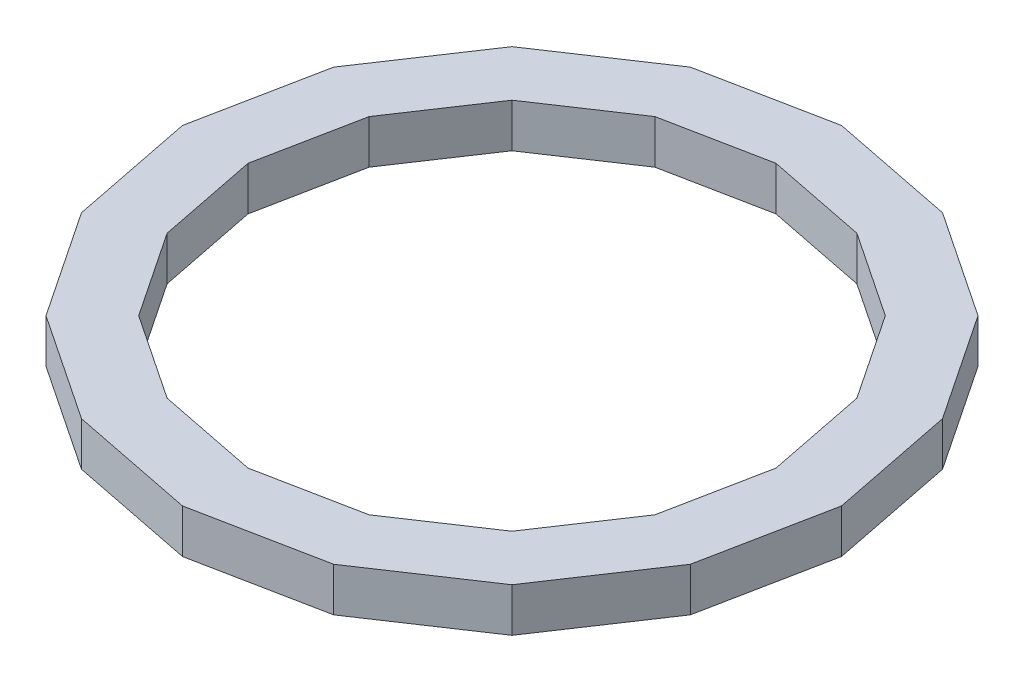
ISO-10303-21;
HEADER;
FILE_DESCRIPTION(('STEP AP214'),'2;1');
FILE_NAME('part.step','',(''),(''),'','','');
FILE_SCHEMA(('AUTOMOTIVE_DESIGN { 1 0 10303 214 1 1 1 1 }'));
ENDSEC;
DATA;
#1=APPLICATION_CONTEXT('core data for automotive mechanical design processes');
#2=APPLICATION_PROTOCOL_DEFINITION('international standard','automotive_design',2000,#1);
#3=PRODUCT_CONTEXT('',#1,'mechanical');
#4=PRODUCT('Part','Part','',(#3));
#5=PRODUCT_RELATED_PRODUCT_CATEGORY('part','',(#4));
#6=PRODUCT_DEFINITION_FORMATION('','',#4);
#7=PRODUCT_DEFINITION_CONTEXT('part definition',#1,'design');
#8=PRODUCT_DEFINITION('design','',#6,#7);
#9=PRODUCT_DEFINITION_SHAPE('','',#8);
#10=(LENGTH_UNIT() NAMED_UNIT(*) SI_UNIT(.MILLI.,.METRE.));
#11=(NAMED_UNIT(*) PLANE_ANGLE_UNIT() SI_UNIT($,.RADIAN.));
#12=(NAMED_UNIT(*) SI_UNIT($,.STERADIAN.) SOLID_ANGLE_UNIT());
#13=UNCERTAINTY_MEASURE_WITH_UNIT(LENGTH_MEASURE(1.E-05),#10,'distance_accuracy_value','');
#14=(GEOMETRIC_REPRESENTATION_CONTEXT(3) GLOBAL_UNCERTAINTY_ASSIGNED_CONTEXT((#13)) GLOBAL_UNIT_ASSIGNED_CONTEXT((#10,
#11,#12)) REPRESENTATION_CONTEXT('',''));
#15=CARTESIAN_POINT('',(0.,0.,0.));
#16=DIRECTION('',(0.,0.,1.));
#17=DIRECTION('',(1.,0.,0.));
#18=AXIS2_PLACEMENT_3D('',#15,#16,#17);
#19=CARTESIAN_POINT('',(0.,19.05,0.));
#20=DIRECTION('',(0.,1.,0.));
#21=DIRECTION('',(0.,0.,1.));
#22=AXIS2_PLACEMENT_3D('',#19,#20,#21);
#23=PLANE('',#22);
#24=DIRECTION('',(0.195090322016117,0.,-0.980785280403233));
#25=VECTOR('',#24,1.);
#26=CARTESIAN_POINT('',(132.314068025535,19.05,54.8062814689309));
#27=LINE('',#26,#25);
#28=CARTESIAN_POINT('',(132.314068025535,19.05,54.8062814689309));
#29=VERTEX_POINT('',#28);
#30=CARTESIAN_POINT('',(143.215715219795,19.05,-1.60635137054443E-12));
#31=VERTEX_POINT('',#30);
#32=EDGE_CURVE('E376',#29,#31,#27,.T.);
#33=ORIENTED_EDGE('',*,*,#32,.T.);
#34=DIRECTION('',(-0.195090322016139,0.,-0.980785280403228));
#35=VECTOR('',#34,1.);
#36=CARTESIAN_POINT('',(143.215715219795,19.05,-1.60635137054443E-12));
#37=LINE('',#36,#35);
#38=CARTESIAN_POINT('',(132.314068025533,19.05,-54.806281468934));
#39=VERTEX_POINT('',#38);
#40=EDGE_CURVE('E379',#31,#39,#37,.T.);
#41=ORIENTED_EDGE('',*,*,#40,.T.);
#42=DIRECTION('',(-0.555570233019612,0.,-0.831469612302539));
#43=VECTOR('',#42,1.);
#44=CARTESIAN_POINT('',(132.314068025533,19.05,-54.806281468934));
#45=LINE('',#44,#43);
#46=CARTESIAN_POINT('',(101.268803404397,19.05,-101.2688034044));
#47=VERTEX_POINT('',#46);
#48=EDGE_CURVE('E382',#39,#47,#45,.T.);
#49=ORIENTED_EDGE('',*,*,#48,.T.);
#50=DIRECTION('',(-0.831469612302551,0.,-0.555570233019593));
#51=VECTOR('',#50,1.);
#52=CARTESIAN_POINT('',(101.268803404397,19.05,-101.2688034044));
#53=LINE('',#52,#51);
#54=CARTESIAN_POINT('',(54.8062814689308,19.05,-132.314068025535));
#55=VERTEX_POINT('',#54);
#56=EDGE_CURVE('E384',#47,#55,#53,.T.);
#57=ORIENTED_EDGE('',*,*,#56,.T.);
#58=DIRECTION('',(-0.980785280403233,0.,-0.195090322016117));
#59=VECTOR('',#58,1.);
#60=CARTESIAN_POINT('',(54.8062814689308,19.05,-132.314068025535));
#61=LINE('',#60,#59);
#62=CARTESIAN_POINT('',(-1.70496894739643E-12,19.05,-143.215715219795));
#63=VERTEX_POINT('',#62);
#64=EDGE_CURVE('E386',#55,#63,#61,.T.);
#65=ORIENTED_EDGE('',*,*,#64,.T.);
#66=DIRECTION('',(-0.980785280403228,0.,0.195090322016139));
#67=VECTOR('',#66,1.);
#68=CARTESIAN_POINT('',(-1.70496894739643E-12,19.05,-143.215715219795));
#69=LINE('',#68,#67);
#70=CARTESIAN_POINT('',(-54.806281468934,19.05,-132.314068025533));
#71=VERTEX_POINT('',#70);
#72=EDGE_CURVE('E388',#63,#71,#69,.T.);
#73=ORIENTED_EDGE('',*,*,#72,.T.);
#74=DIRECTION('',(-0.831469612302539,0.,0.555570233019612));
#75=VECTOR('',#74,1.);
#76=CARTESIAN_POINT('',(-54.806281468934,19.05,-132.314068025533));
#77=LINE('',#76,#75);
#78=CARTESIAN_POINT('',(-101.2688034044,19.05,-101.268803404397));
#79=VERTEX_POINT('',#78);
#80=EDGE_CURVE('E390',#71,#79,#77,.T.);
#81=ORIENTED_EDGE('',*,*,#80,.T.);
#82=DIRECTION('',(-0.555570233019593,0.,0.831469612302552));
#83=VECTOR('',#82,1.);
#84=CARTESIAN_POINT('',(-101.2688034044,19.05,-101.268803404397));
#85=LINE('',#84,#83);
#86=CARTESIAN_POINT('',(-132.314068025535,19.05,-54.8062814689309));
#87=VERTEX_POINT('',#86);
#88=EDGE_CURVE('E392',#79,#87,#85,.T.);
#89=ORIENTED_EDGE('',*,*,#88,.T.);
#90=DIRECTION('',(-0.195090322016117,0.,0.980785280403233));
#91=VECTOR('',#90,1.);
#92=CARTESIAN_POINT('',(-132.314068025535,19.05,-54.8062814689309));
#93=LINE('',#92,#91);
#94=CARTESIAN_POINT('',(-143.215715219795,19.05,1.60751201898995E-12));
#95=VERTEX_POINT('',#94);
#96=EDGE_CURVE('E395',#87,#95,#93,.T.);
#97=ORIENTED_EDGE('',*,*,#96,.T.);
#98=DIRECTION('',(0.195090322016139,0.,0.980785280403228));
#99=VECTOR('',#98,1.);
#100=CARTESIAN_POINT('',(-143.215715219795,19.05,1.60751201898995E-12));
#101=LINE('',#100,#99);
#102=CARTESIAN_POINT('',(-132.314068025533,19.05,54.806281468934));
#103=VERTEX_POINT('',#102);
#104=EDGE_CURVE('E397',#95,#103,#101,.T.);
#105=ORIENTED_EDGE('',*,*,#104,.T.);
#106=DIRECTION('',(0.555570233019612,0.,0.831469612302539));
#107=VECTOR('',#106,1.);
#108=CARTESIAN_POINT('',(-132.314068025533,19.05,54.806281468934));
#109=LINE('',#108,#107);
#110=CARTESIAN_POINT('',(-101.268803404397,19.05,101.2688034044));
#111=VERTEX_POINT('',#110);
#112=EDGE_CURVE('E399',#103,#111,#109,.T.);
#113=ORIENTED_EDGE('',*,*,#112,.T.);
#114=DIRECTION('',(0.831469612302552,0.,0.555570233019593));
#115=VECTOR('',#114,1.);
#116=CARTESIAN_POINT('',(-101.268803404397,19.05,101.2688034044));
#117=LINE('',#116,#115);
#118=CARTESIAN_POINT('',(-54.806281468931,19.05,132.314068025535));
#119=VERTEX_POINT('',#118);
#120=EDGE_CURVE('E402',#111,#119,#117,.T.);
#121=ORIENTED_EDGE('',*,*,#120,.T.);
#122=DIRECTION('',(0.980785280403233,0.,0.195090322016118));
#123=VECTOR('',#122,1.);
#124=CARTESIAN_POINT('',(-54.806281468931,19.05,132.314068025535));
#125=LINE('',#124,#123);
#126=CARTESIAN_POINT('',(1.54858701511086E-12,19.05,143.215715219795));
#127=VERTEX_POINT('',#126);
#128=EDGE_CURVE('E405',#119,#127,#125,.T.);
#129=ORIENTED_EDGE('',*,*,#128,.T.);
#130=DIRECTION('',(0.980785280403228,0.,-0.19509032201614));
#131=VECTOR('',#130,1.);
#132=CARTESIAN_POINT('',(1.54858701511086E-12,19.05,143.215715219795));
#133=LINE('',#132,#131);
#134=CARTESIAN_POINT('',(54.8062814689339,19.05,132.314068025533));
#135=VERTEX_POINT('',#134);
#136=EDGE_CURVE('E407',#127,#135,#133,.T.);
#137=ORIENTED_EDGE('',*,*,#136,.T.);
#138=DIRECTION('',(0.831469612302539,0.,-0.555570233019611));
#139=VECTOR('',#138,1.);
#140=CARTESIAN_POINT('',(54.8062814689339,19.05,132.314068025533));
#141=LINE('',#140,#139);
#142=CARTESIAN_POINT('',(101.2688034044,19.05,101.268803404397));
#143=VERTEX_POINT('',#142);
#144=EDGE_CURVE('E410',#135,#143,#141,.T.);
#145=ORIENTED_EDGE('',*,*,#144,.T.);
#146=DIRECTION('',(0.555570233019593,0.,-0.831469612302552));
#147=VECTOR('',#146,1.);
#148=CARTESIAN_POINT('',(101.2688034044,19.05,101.268803404397));
#149=LINE('',#148,#147);
#150=EDGE_CURVE('E413',#143,#29,#149,.T.);
#151=ORIENTED_EDGE('',*,*,#150,.T.);
#152=EDGE_LOOP('',(#33,#41,#49,#57,#65,#73,#81,#89,#97,#105,#113,#121,#129,#137,#145,#151));
#153=FACE_BOUND('',#152,.T.);
#154=DIRECTION('',(-0.195090322016139,0.,-0.980785280403228));
#155=VECTOR('',#154,1.);
#156=CARTESIAN_POINT('',(114.728338259455,19.05,-1.33749485110041E-12));
#157=LINE('',#156,#155);
#158=CARTESIAN_POINT('',(114.728338259455,19.05,-1.33749485110041E-12));
#159=VERTEX_POINT('',#158);
#160=CARTESIAN_POINT('',(105.995163516941,19.05,-43.9046342746724));
#161=VERTEX_POINT('',#160);
#162=EDGE_CURVE('E252',#159,#161,#157,.T.);
#163=ORIENTED_EDGE('',*,*,#162,.F.);
#164=DIRECTION('',(0.195090322016117,0.,-0.980785280403233));
#165=VECTOR('',#164,1.);
#166=CARTESIAN_POINT('',(105.995163516942,19.05,43.9046342746699));
#167=LINE('',#166,#165);
#168=CARTESIAN_POINT('',(105.995163516942,19.05,43.9046342746699));
#169=VERTEX_POINT('',#168);
#170=EDGE_CURVE('E243',#169,#159,#167,.T.);
#171=ORIENTED_EDGE('',*,*,#170,.F.);
#172=DIRECTION('',(0.555570233019593,0.,-0.831469612302552));
#173=VECTOR('',#172,1.);
#174=CARTESIAN_POINT('',(81.1251859775254,19.05,81.1251859775235));
#175=LINE('',#174,#173);
#176=CARTESIAN_POINT('',(81.1251859775254,19.05,81.1251859775235));
#177=VERTEX_POINT('',#176);
#178=EDGE_CURVE('E296',#177,#169,#175,.T.);
#179=ORIENTED_EDGE('',*,*,#178,.F.);
#180=DIRECTION('',(0.831469612302539,0.,-0.555570233019612));
#181=VECTOR('',#180,1.);
#182=CARTESIAN_POINT('',(43.9046342746724,19.05,105.995163516941));
#183=LINE('',#182,#181);
#184=CARTESIAN_POINT('',(43.9046342746724,19.05,105.995163516941));
#185=VERTEX_POINT('',#184);
#186=EDGE_CURVE('E294',#185,#177,#183,.T.);
#187=ORIENTED_EDGE('',*,*,#186,.F.);
#188=DIRECTION('',(0.980785280403228,0.,-0.19509032201614));
#189=VECTOR('',#188,1.);
#190=CARTESIAN_POINT('',(1.3258200176862E-12,19.05,114.728338259455));
#191=LINE('',#190,#189);
#192=CARTESIAN_POINT('',(1.3258200176862E-12,19.05,114.728338259455));
#193=VERTEX_POINT('',#192);
#194=EDGE_CURVE('E292',#193,#185,#191,.T.);
#195=ORIENTED_EDGE('',*,*,#194,.F.);
#196=DIRECTION('',(0.980785280403233,0.,0.195090322016117));
#197=VECTOR('',#196,1.);
#198=CARTESIAN_POINT('',(-43.9046342746699,19.05,105.995163516942));
#199=LINE('',#198,#197);
#200=CARTESIAN_POINT('',(-43.9046342746699,19.05,105.995163516942));
#201=VERTEX_POINT('',#200);
#202=EDGE_CURVE('E290',#201,#193,#199,.T.);
#203=ORIENTED_EDGE('',*,*,#202,.F.);
#204=DIRECTION('',(0.831469612302552,0.,0.555570233019593));
#205=VECTOR('',#204,1.);
#206=CARTESIAN_POINT('',(-81.1251859775235,19.05,81.1251859775254));
#207=LINE('',#206,#205);
#208=CARTESIAN_POINT('',(-81.1251859775235,19.05,81.1251859775254));
#209=VERTEX_POINT('',#208);
#210=EDGE_CURVE('E288',#209,#201,#207,.T.);
#211=ORIENTED_EDGE('',*,*,#210,.F.);
#212=DIRECTION('',(0.555570233019612,0.,0.831469612302539));
#213=VECTOR('',#212,1.);
#214=CARTESIAN_POINT('',(-105.995163516941,19.05,43.9046342746724));
#215=LINE('',#214,#213);
#216=CARTESIAN_POINT('',(-105.995163516941,19.05,43.9046342746724));
#217=VERTEX_POINT('',#216);
#218=EDGE_CURVE('E285',#217,#209,#215,.T.);
#219=ORIENTED_EDGE('',*,*,#218,.F.);
#220=DIRECTION('',(0.195090322016139,0.,0.980785280403228));
#221=VECTOR('',#220,1.);
#222=CARTESIAN_POINT('',(-114.728338259455,19.05,1.36437975131882E-12));
#223=LINE('',#222,#221);
#224=CARTESIAN_POINT('',(-114.728338259455,19.05,1.36437975131882E-12));
#225=VERTEX_POINT('',#224);
#226=EDGE_CURVE('E283',#225,#217,#223,.T.);
#227=ORIENTED_EDGE('',*,*,#226,.F.);
#228=DIRECTION('',(-0.195090322016117,0.,0.980785280403233));
#229=VECTOR('',#228,1.);
#230=CARTESIAN_POINT('',(-105.995163516942,19.05,-43.9046342746699));
#231=LINE('',#230,#229);
#232=CARTESIAN_POINT('',(-105.995163516942,19.05,-43.9046342746699));
#233=VERTEX_POINT('',#232);
#234=EDGE_CURVE('E280',#233,#225,#231,.T.);
#235=ORIENTED_EDGE('',*,*,#234,.F.);
#236=DIRECTION('',(-0.555570233019593,0.,0.831469612302552));
#237=VECTOR('',#236,1.);
#238=CARTESIAN_POINT('',(-81.1251859775253,19.05,-81.1251859775235));
#239=LINE('',#238,#237);
#240=CARTESIAN_POINT('',(-81.1251859775253,19.05,-81.1251859775235));
#241=VERTEX_POINT('',#240);
#242=EDGE_CURVE('E277',#241,#233,#239,.T.);
#243=ORIENTED_EDGE('',*,*,#242,.F.);
#244=DIRECTION('',(-0.831469612302539,0.,0.555570233019612));
#245=VECTOR('',#244,1.);
#246=CARTESIAN_POINT('',(-43.9046342746724,19.05,-105.995163516941));
#247=LINE('',#246,#245);
#248=CARTESIAN_POINT('',(-43.9046342746724,19.05,-105.995163516941));
#249=VERTEX_POINT('',#248);
#250=EDGE_CURVE('E275',#249,#241,#247,.T.);
#251=ORIENTED_EDGE('',*,*,#250,.F.);
#252=DIRECTION('',(-0.980785280403228,0.,0.19509032201614));
#253=VECTOR('',#252,1.);
#254=CARTESIAN_POINT('',(-1.35447008747833E-12,19.05,-114.728338259455));
#255=LINE('',#254,#253);
#256=CARTESIAN_POINT('',(-1.35447008747833E-12,19.05,-114.728338259455));
#257=VERTEX_POINT('',#256);
#258=EDGE_CURVE('E273',#257,#249,#255,.T.);
#259=ORIENTED_EDGE('',*,*,#258,.F.);
#260=DIRECTION('',(-0.980785280403233,0.,-0.195090322016117));
#261=VECTOR('',#260,1.);
#262=CARTESIAN_POINT('',(43.90463427467,19.05,-105.995163516942));
#263=LINE('',#262,#261);
#264=CARTESIAN_POINT('',(43.90463427467,19.05,-105.995163516942));
#265=VERTEX_POINT('',#264);
#266=EDGE_CURVE('E271',#265,#257,#263,.T.);
#267=ORIENTED_EDGE('',*,*,#266,.F.);
#268=DIRECTION('',(-0.831469612302552,0.,-0.555570233019592));
#269=VECTOR('',#268,1.);
#270=CARTESIAN_POINT('',(81.1251859775235,19.05,-81.1251859775254));
#271=LINE('',#270,#269);
#272=CARTESIAN_POINT('',(81.1251859775235,19.05,-81.1251859775254));
#273=VERTEX_POINT('',#272);
#274=EDGE_CURVE('E267',#273,#265,#271,.T.);
#275=ORIENTED_EDGE('',*,*,#274,.F.);
#276=DIRECTION('',(-0.555570233019612,0.,-0.831469612302539));
#277=VECTOR('',#276,1.);
#278=CARTESIAN_POINT('',(105.995163516941,19.05,-43.9046342746724));
#279=LINE('',#278,#277);
#280=EDGE_CURVE('E265',#161,#273,#279,.T.);
#281=ORIENTED_EDGE('',*,*,#280,.F.);
#282=EDGE_LOOP('',(#163,#171,#179,#187,#195,#203,#211,#219,#227,#235,#243,#251,#259,#267,#275,#281));
#283=FACE_BOUND('',#282,.T.);
#284=ADVANCED_FACE('F34',(#153,#283),#23,.T.);
#285=CARTESIAN_POINT('',(0.,0.,0.));
#286=DIRECTION('',(0.,1.,0.));
#287=DIRECTION('',(0.,0.,1.));
#288=AXIS2_PLACEMENT_3D('',#285,#286,#287);
#289=PLANE('',#288);
#290=DIRECTION('',(0.195090322016117,0.,-0.980785280403233));
#291=VECTOR('',#290,1.);
#292=CARTESIAN_POINT('',(132.314068025535,0.,54.8062814689309));
#293=LINE('',#292,#291);
#294=CARTESIAN_POINT('',(132.314068025535,0.,54.8062814689309));
#295=VERTEX_POINT('',#294);
#296=CARTESIAN_POINT('',(143.215715219795,0.,-1.60635137054443E-12));
#297=VERTEX_POINT('',#296);
#298=EDGE_CURVE('E260',#295,#297,#293,.T.);
#299=ORIENTED_EDGE('',*,*,#298,.F.);
#300=DIRECTION('',(0.555570233019593,0.,-0.831469612302552));
#301=VECTOR('',#300,1.);
#302=CARTESIAN_POINT('',(101.2688034044,0.,101.268803404397));
#303=LINE('',#302,#301);
#304=CARTESIAN_POINT('',(101.2688034044,0.,101.268803404397));
#305=VERTEX_POINT('',#304);
#306=EDGE_CURVE('E380',#305,#295,#303,.T.);
#307=ORIENTED_EDGE('',*,*,#306,.F.);
#308=DIRECTION('',(0.831469612302539,0.,-0.555570233019611));
#309=VECTOR('',#308,1.);
#310=CARTESIAN_POINT('',(54.8062814689339,0.,132.314068025533));
#311=LINE('',#310,#309);
#312=CARTESIAN_POINT('',(54.8062814689339,0.,132.314068025533));
#313=VERTEX_POINT('',#312);
#314=EDGE_CURVE('E448',#313,#305,#311,.T.);
#315=ORIENTED_EDGE('',*,*,#314,.F.);
#316=DIRECTION('',(0.980785280403228,0.,-0.19509032201614));
#317=VECTOR('',#316,1.);
#318=CARTESIAN_POINT('',(1.54858701511086E-12,0.,143.215715219795));
#319=LINE('',#318,#317);
#320=CARTESIAN_POINT('',(1.54858701511086E-12,0.,143.215715219795));
#321=VERTEX_POINT('',#320);
#322=EDGE_CURVE('E445',#321,#313,#319,.T.);
#323=ORIENTED_EDGE('',*,*,#322,.F.);
#324=DIRECTION('',(0.980785280403233,0.,0.195090322016118));
#325=VECTOR('',#324,1.);
#326=CARTESIAN_POINT('',(-54.806281468931,0.,132.314068025535));
#327=LINE('',#326,#325);
#328=CARTESIAN_POINT('',(-54.806281468931,0.,132.314068025535));
#329=VERTEX_POINT('',#328);
#330=EDGE_CURVE('E442',#329,#321,#327,.T.);
#331=ORIENTED_EDGE('',*,*,#330,.F.);
#332=DIRECTION('',(0.831469612302552,0.,0.555570233019593));
#333=VECTOR('',#332,1.);
#334=CARTESIAN_POINT('',(-101.268803404397,0.,101.2688034044));
#335=LINE('',#334,#333);
#336=CARTESIAN_POINT('',(-101.268803404397,0.,101.2688034044));
#337=VERTEX_POINT('',#336);
#338=EDGE_CURVE('E439',#337,#329,#335,.T.);
#339=ORIENTED_EDGE('',*,*,#338,.F.);
#340=DIRECTION('',(0.555570233019612,0.,0.831469612302539));
#341=VECTOR('',#340,1.);
#342=CARTESIAN_POINT('',(-132.314068025533,0.,54.806281468934));
#343=LINE('',#342,#341);
#344=CARTESIAN_POINT('',(-132.314068025533,0.,54.806281468934));
#345=VERTEX_POINT('',#344);
#346=EDGE_CURVE('E437',#345,#337,#343,.T.);
#347=ORIENTED_EDGE('',*,*,#346,.F.);
#348=DIRECTION('',(0.195090322016139,0.,0.980785280403228));
#349=VECTOR('',#348,1.);
#350=CARTESIAN_POINT('',(-143.215715219795,0.,1.60751201898995E-12));
#351=LINE('',#350,#349);
#352=CARTESIAN_POINT('',(-143.215715219795,0.,1.60751201898995E-12));
#353=VERTEX_POINT('',#352);
#354=EDGE_CURVE('E434',#353,#345,#351,.T.);
#355=ORIENTED_EDGE('',*,*,#354,.F.);
#356=DIRECTION('',(-0.195090322016117,0.,0.980785280403233));
#357=VECTOR('',#356,1.);
#358=CARTESIAN_POINT('',(-132.314068025535,0.,-54.8062814689309));
#359=LINE('',#358,#357);
#360=CARTESIAN_POINT('',(-132.314068025535,0.,-54.8062814689309));
#361=VERTEX_POINT('',#360);
#362=EDGE_CURVE('E432',#361,#353,#359,.T.);
#363=ORIENTED_EDGE('',*,*,#362,.F.);
#364=DIRECTION('',(-0.555570233019593,0.,0.831469612302552));
#365=VECTOR('',#364,1.);
#366=CARTESIAN_POINT('',(-101.2688034044,0.,-101.268803404397));
#367=LINE('',#366,#365);
#368=CARTESIAN_POINT('',(-101.2688034044,0.,-101.268803404397));
#369=VERTEX_POINT('',#368);
#370=EDGE_CURVE('E430',#369,#361,#367,.T.);
#371=ORIENTED_EDGE('',*,*,#370,.F.);
#372=DIRECTION('',(-0.831469612302539,0.,0.555570233019612));
#373=VECTOR('',#372,1.);
#374=CARTESIAN_POINT('',(-54.806281468934,0.,-132.314068025533));
#375=LINE('',#374,#373);
#376=CARTESIAN_POINT('',(-54.806281468934,0.,-132.314068025533));
#377=VERTEX_POINT('',#376);
#378=EDGE_CURVE('E428',#377,#369,#375,.T.);
#379=ORIENTED_EDGE('',*,*,#378,.F.);
#380=DIRECTION('',(-0.980785280403228,0.,0.195090322016139));
#381=VECTOR('',#380,1.);
#382=CARTESIAN_POINT('',(-1.70496894739643E-12,0.,-143.215715219795));
#383=LINE('',#382,#381);
#384=CARTESIAN_POINT('',(-1.70496894739643E-12,0.,-143.215715219795));
#385=VERTEX_POINT('',#384);
#386=EDGE_CURVE('E426',#385,#377,#383,.T.);
#387=ORIENTED_EDGE('',*,*,#386,.F.);
#388=DIRECTION('',(-0.980785280403233,0.,-0.195090322016117));
#389=VECTOR('',#388,1.);
#390=CARTESIAN_POINT('',(54.8062814689308,0.,-132.314068025535));
#391=LINE('',#390,#389);
#392=CARTESIAN_POINT('',(54.8062814689308,0.,-132.314068025535));
#393=VERTEX_POINT('',#392);
#394=EDGE_CURVE('E424',#393,#385,#391,.T.);
#395=ORIENTED_EDGE('',*,*,#394,.F.);
#396=DIRECTION('',(-0.831469612302551,0.,-0.555570233019593));
#397=VECTOR('',#396,1.);
#398=CARTESIAN_POINT('',(101.268803404397,0.,-101.2688034044));
#399=LINE('',#398,#397);
#400=CARTESIAN_POINT('',(101.268803404397,0.,-101.2688034044));
#401=VERTEX_POINT('',#400);
#402=EDGE_CURVE('E422',#401,#393,#399,.T.);
#403=ORIENTED_EDGE('',*,*,#402,.F.);
#404=DIRECTION('',(-0.555570233019612,0.,-0.831469612302539));
#405=VECTOR('',#404,1.);
#406=CARTESIAN_POINT('',(132.314068025533,0.,-54.806281468934));
#407=LINE('',#406,#405);
#408=CARTESIAN_POINT('',(132.314068025533,0.,-54.806281468934));
#409=VERTEX_POINT('',#408);
#410=EDGE_CURVE('E420',#409,#401,#407,.T.);
#411=ORIENTED_EDGE('',*,*,#410,.F.);
#412=DIRECTION('',(-0.195090322016139,0.,-0.980785280403228));
#413=VECTOR('',#412,1.);
#414=CARTESIAN_POINT('',(143.215715219795,0.,-1.60635137054443E-12));
#415=LINE('',#414,#413);
#416=EDGE_CURVE('E418',#297,#409,#415,.T.);
#417=ORIENTED_EDGE('',*,*,#416,.F.);
#418=EDGE_LOOP('',(#299,#307,#315,#323,#331,#339,#347,#355,#363,#371,#379,#387,#395,#403,#411,#417));
#419=FACE_BOUND('',#418,.T.);
#420=DIRECTION('',(0.195090322016117,0.,-0.980785280403233));
#421=VECTOR('',#420,1.);
#422=CARTESIAN_POINT('',(105.995163516942,0.,43.9046342746699));
#423=LINE('',#422,#421);
#424=CARTESIAN_POINT('',(105.995163516942,0.,43.9046342746699));
#425=VERTEX_POINT('',#424);
#426=CARTESIAN_POINT('',(114.728338259455,0.,-1.33749485110041E-12));
#427=VERTEX_POINT('',#426);
#428=EDGE_CURVE('E57',#425,#427,#423,.T.);
#429=ORIENTED_EDGE('',*,*,#428,.T.);
#430=DIRECTION('',(-0.195090322016139,0.,-0.980785280403228));
#431=VECTOR('',#430,1.);
#432=CARTESIAN_POINT('',(114.728338259455,0.,-1.33749485110041E-12));
#433=LINE('',#432,#431);
#434=CARTESIAN_POINT('',(105.995163516941,0.,-43.9046342746724));
#435=VERTEX_POINT('',#434);
#436=EDGE_CURVE('E259',#427,#435,#433,.T.);
#437=ORIENTED_EDGE('',*,*,#436,.T.);
#438=DIRECTION('',(-0.555570233019612,0.,-0.831469612302539));
#439=VECTOR('',#438,1.);
#440=CARTESIAN_POINT('',(105.995163516941,0.,-43.9046342746724));
#441=LINE('',#440,#439);
#442=CARTESIAN_POINT('',(81.1251859775235,0.,-81.1251859775254));
#443=VERTEX_POINT('',#442);
#444=EDGE_CURVE('E300',#435,#443,#441,.T.);
#445=ORIENTED_EDGE('',*,*,#444,.T.);
#446=DIRECTION('',(-0.831469612302552,0.,-0.555570233019592));
#447=VECTOR('',#446,1.);
#448=CARTESIAN_POINT('',(81.1251859775235,0.,-81.1251859775254));
#449=LINE('',#448,#447);
#450=CARTESIAN_POINT('',(43.90463427467,0.,-105.995163516942));
#451=VERTEX_POINT('',#450);
#452=EDGE_CURVE('E303',#443,#451,#449,.T.);
#453=ORIENTED_EDGE('',*,*,#452,.T.);
#454=DIRECTION('',(-0.980785280403233,0.,-0.195090322016117));
#455=VECTOR('',#454,1.);
#456=CARTESIAN_POINT('',(43.90463427467,0.,-105.995163516942));
#457=LINE('',#456,#455);
#458=CARTESIAN_POINT('',(-1.35447008747833E-12,0.,-114.728338259455));
#459=VERTEX_POINT('',#458);
#460=EDGE_CURVE('E306',#451,#459,#457,.T.);
#461=ORIENTED_EDGE('',*,*,#460,.T.);
#462=DIRECTION('',(-0.980785280403228,0.,0.19509032201614));
#463=VECTOR('',#462,1.);
#464=CARTESIAN_POINT('',(-1.35447008747833E-12,0.,-114.728338259455));
#465=LINE('',#464,#463);
#466=CARTESIAN_POINT('',(-43.9046342746724,0.,-105.995163516941));
#467=VERTEX_POINT('',#466);
#468=EDGE_CURVE('E310',#459,#467,#465,.T.);
#469=ORIENTED_EDGE('',*,*,#468,.T.);
#470=DIRECTION('',(-0.831469612302539,0.,0.555570233019612));
#471=VECTOR('',#470,1.);
#472=CARTESIAN_POINT('',(-43.9046342746724,0.,-105.995163516941));
#473=LINE('',#472,#471);
#474=CARTESIAN_POINT('',(-81.1251859775253,0.,-81.1251859775235));
#475=VERTEX_POINT('',#474);
#476=EDGE_CURVE('E313',#467,#475,#473,.T.);
#477=ORIENTED_EDGE('',*,*,#476,.T.);
#478=DIRECTION('',(-0.555570233019593,0.,0.831469612302552));
#479=VECTOR('',#478,1.);
#480=CARTESIAN_POINT('',(-81.1251859775253,0.,-81.1251859775235));
#481=LINE('',#480,#479);
#482=CARTESIAN_POINT('',(-105.995163516942,0.,-43.9046342746699));
#483=VERTEX_POINT('',#482);
#484=EDGE_CURVE('E316',#475,#483,#481,.T.);
#485=ORIENTED_EDGE('',*,*,#484,.T.);
#486=DIRECTION('',(-0.195090322016117,0.,0.980785280403233));
#487=VECTOR('',#486,1.);
#488=CARTESIAN_POINT('',(-105.995163516942,0.,-43.9046342746699));
#489=LINE('',#488,#487);
#490=CARTESIAN_POINT('',(-114.728338259455,0.,1.36437975131882E-12));
#491=VERTEX_POINT('',#490);
#492=EDGE_CURVE('E319',#483,#491,#489,.T.);
#493=ORIENTED_EDGE('',*,*,#492,.T.);
#494=DIRECTION('',(0.195090322016139,0.,0.980785280403228));
#495=VECTOR('',#494,1.);
#496=CARTESIAN_POINT('',(-114.728338259455,0.,1.36437975131882E-12));
#497=LINE('',#496,#495);
#498=CARTESIAN_POINT('',(-105.995163516941,0.,43.9046342746724));
#499=VERTEX_POINT('',#498);
#500=EDGE_CURVE('E323',#491,#499,#497,.T.);
#501=ORIENTED_EDGE('',*,*,#500,.T.);
#502=DIRECTION('',(0.555570233019612,0.,0.831469612302539));
#503=VECTOR('',#502,1.);
#504=CARTESIAN_POINT('',(-105.995163516941,0.,43.9046342746724));
#505=LINE('',#504,#503);
#506=CARTESIAN_POINT('',(-81.1251859775235,0.,81.1251859775254));
#507=VERTEX_POINT('',#506);
#508=EDGE_CURVE('E326',#499,#507,#505,.T.);
#509=ORIENTED_EDGE('',*,*,#508,.T.);
#510=DIRECTION('',(0.831469612302552,0.,0.555570233019593));
#511=VECTOR('',#510,1.);
#512=CARTESIAN_POINT('',(-81.1251859775235,0.,81.1251859775254));
#513=LINE('',#512,#511);
#514=CARTESIAN_POINT('',(-43.9046342746699,0.,105.995163516942));
#515=VERTEX_POINT('',#514);
#516=EDGE_CURVE('E329',#507,#515,#513,.T.);
#517=ORIENTED_EDGE('',*,*,#516,.T.);
#518=DIRECTION('',(0.980785280403233,0.,0.195090322016117));
#519=VECTOR('',#518,1.);
#520=CARTESIAN_POINT('',(-43.9046342746699,0.,105.995163516942));
#521=LINE('',#520,#519);
#522=CARTESIAN_POINT('',(1.3258200176862E-12,0.,114.728338259455));
#523=VERTEX_POINT('',#522);
#524=EDGE_CURVE('E332',#515,#523,#521,.T.);
#525=ORIENTED_EDGE('',*,*,#524,.T.);
#526=DIRECTION('',(0.980785280403228,0.,-0.19509032201614));
#527=VECTOR('',#526,1.);
#528=CARTESIAN_POINT('',(1.3258200176862E-12,0.,114.728338259455));
#529=LINE('',#528,#527);
#530=CARTESIAN_POINT('',(43.9046342746724,0.,105.995163516941));
#531=VERTEX_POINT('',#530);
#532=EDGE_CURVE('E335',#523,#531,#529,.T.);
#533=ORIENTED_EDGE('',*,*,#532,.T.);
#534=DIRECTION('',(0.831469612302539,0.,-0.555570233019612));
#535=VECTOR('',#534,1.);
#536=CARTESIAN_POINT('',(43.9046342746724,0.,105.995163516941));
#537=LINE('',#536,#535);
#538=CARTESIAN_POINT('',(81.1251859775254,0.,81.1251859775235));
#539=VERTEX_POINT('',#538);
#540=EDGE_CURVE('E339',#531,#539,#537,.T.);
#541=ORIENTED_EDGE('',*,*,#540,.T.);
#542=DIRECTION('',(0.555570233019593,0.,-0.831469612302552));
#543=VECTOR('',#542,1.);
#544=CARTESIAN_POINT('',(81.1251859775254,0.,81.1251859775235));
#545=LINE('',#544,#543);
#546=EDGE_CURVE('E253',#539,#425,#545,.T.);
#547=ORIENTED_EDGE('',*,*,#546,.T.);
#548=EDGE_LOOP('',(#429,#437,#445,#453,#461,#469,#477,#485,#493,#501,#509,#517,#525,#533,#541,#547));
#549=FACE_BOUND('',#548,.T.);
#550=ADVANCED_FACE('F506',(#419,#549),#289,.F.);
#551=CARTESIAN_POINT('',(132.314068025535,19.05,54.8062814689309));
#552=DIRECTION('',(-0.980785280403233,0.,-0.195090322016117));
#553=DIRECTION('',(-0.195090322016117,0.,0.980785280403233));
#554=AXIS2_PLACEMENT_3D('',#551,#552,#553);
#555=PLANE('',#554);
#556=ORIENTED_EDGE('',*,*,#298,.T.);
#557=DIRECTION('',(0.,-1.,0.));
#558=VECTOR('',#557,1.);
#559=CARTESIAN_POINT('',(143.215715219795,19.05,-1.60635137054443E-12));
#560=LINE('',#559,#558);
#561=EDGE_CURVE('E11',#31,#297,#560,.T.);
#562=ORIENTED_EDGE('',*,*,#561,.F.);
#563=ORIENTED_EDGE('',*,*,#32,.F.);
#564=DIRECTION('',(0.,-1.,0.));
#565=VECTOR('',#564,1.);
#566=CARTESIAN_POINT('',(132.314068025535,19.05,54.8062814689309));
#567=LINE('',#566,#565);
#568=EDGE_CURVE('E415',#29,#295,#567,.T.);
#569=ORIENTED_EDGE('',*,*,#568,.T.);
#570=EDGE_LOOP('',(#556,#562,#563,#569));
#571=FACE_BOUND('',#570,.T.);
#572=ADVANCED_FACE('F36',(#571),#555,.F.);
#573=CARTESIAN_POINT('',(143.215715219795,19.05,-1.60635137054443E-12));
#574=DIRECTION('',(-0.980785280403228,0.,0.195090322016139));
#575=DIRECTION('',(0.195090322016139,0.,0.980785280403229));
#576=AXIS2_PLACEMENT_3D('',#573,#574,#575);
#577=PLANE('',#576);
#578=ORIENTED_EDGE('',*,*,#416,.T.);
#579=DIRECTION('',(0.,-1.,0.));
#580=VECTOR('',#579,1.);
#581=CARTESIAN_POINT('',(132.314068025533,19.05,-54.806281468934));
#582=LINE('',#581,#580);
#583=EDGE_CURVE('E42',#39,#409,#582,.T.);
#584=ORIENTED_EDGE('',*,*,#583,.F.);
#585=ORIENTED_EDGE('',*,*,#40,.F.);
#586=ORIENTED_EDGE('',*,*,#561,.T.);
#587=EDGE_LOOP('',(#578,#584,#585,#586));
#588=FACE_BOUND('',#587,.T.);
#589=ADVANCED_FACE('F523',(#588),#577,.F.);
#590=CARTESIAN_POINT('',(132.314068025533,19.05,-54.806281468934));
#591=DIRECTION('',(-0.831469612302539,0.,0.555570233019612));
#592=DIRECTION('',(0.555570233019612,0.,0.831469612302539));
#593=AXIS2_PLACEMENT_3D('',#590,#591,#592);
#594=PLANE('',#593);
#595=ORIENTED_EDGE('',*,*,#410,.T.);
#596=DIRECTION('',(0.,-1.,0.));
#597=VECTOR('',#596,1.);
#598=CARTESIAN_POINT('',(101.268803404397,19.05,-101.2688034044));
#599=LINE('',#598,#597);
#600=EDGE_CURVE('E493',#47,#401,#599,.T.);
#601=ORIENTED_EDGE('',*,*,#600,.F.);
#602=ORIENTED_EDGE('',*,*,#48,.F.);
#603=ORIENTED_EDGE('',*,*,#583,.T.);
#604=EDGE_LOOP('',(#595,#601,#602,#603));
#605=FACE_BOUND('',#604,.T.);
#606=ADVANCED_FACE('F500',(#605),#594,.F.);
#607=CARTESIAN_POINT('',(101.268803404397,19.05,-101.2688034044));
#608=DIRECTION('',(-0.555570233019593,0.,0.831469612302552));
#609=DIRECTION('',(0.831469612302552,0.,0.555570233019593));
#610=AXIS2_PLACEMENT_3D('',#607,#608,#609);
#611=PLANE('',#610);
#612=ORIENTED_EDGE('',*,*,#402,.T.);
#613=DIRECTION('',(0.,-1.,0.));
#614=VECTOR('',#613,1.);
#615=CARTESIAN_POINT('',(54.8062814689308,19.05,-132.314068025535));
#616=LINE('',#615,#614);
#617=EDGE_CURVE('E489',#55,#393,#616,.T.);
#618=ORIENTED_EDGE('',*,*,#617,.F.);
#619=ORIENTED_EDGE('',*,*,#56,.F.);
#620=ORIENTED_EDGE('',*,*,#600,.T.);
#621=EDGE_LOOP('',(#612,#618,#619,#620));
#622=FACE_BOUND('',#621,.T.);
#623=ADVANCED_FACE('F512',(#622),#611,.F.);
#624=CARTESIAN_POINT('',(54.8062814689308,19.05,-132.314068025535));
#625=DIRECTION('',(-0.195090322016117,0.,0.980785280403233));
#626=DIRECTION('',(0.980785280403233,0.,0.195090322016117));
#627=AXIS2_PLACEMENT_3D('',#624,#625,#626);
#628=PLANE('',#627);
#629=ORIENTED_EDGE('',*,*,#394,.T.);
#630=DIRECTION('',(0.,-1.,0.));
#631=VECTOR('',#630,1.);
#632=CARTESIAN_POINT('',(-1.70496894739643E-12,19.05,-143.215715219795));
#633=LINE('',#632,#631);
#634=EDGE_CURVE('E485',#63,#385,#633,.T.);
#635=ORIENTED_EDGE('',*,*,#634,.F.);
#636=ORIENTED_EDGE('',*,*,#64,.F.);
#637=ORIENTED_EDGE('',*,*,#617,.T.);
#638=EDGE_LOOP('',(#629,#635,#636,#637));
#639=FACE_BOUND('',#638,.T.);
#640=ADVANCED_FACE('F516',(#639),#628,.F.);
#641=CARTESIAN_POINT('',(-1.70496894739643E-12,19.05,-143.215715219795));
#642=DIRECTION('',(0.195090322016139,0.,0.980785280403228));
#643=DIRECTION('',(0.980785280403228,0.,-0.195090322016139));
#644=AXIS2_PLACEMENT_3D('',#641,#642,#643);
#645=PLANE('',#644);
#646=ORIENTED_EDGE('',*,*,#386,.T.);
#647=DIRECTION('',(0.,-1.,0.));
#648=VECTOR('',#647,1.);
#649=CARTESIAN_POINT('',(-54.806281468934,19.05,-132.314068025533));
#650=LINE('',#649,#648);
#651=EDGE_CURVE('E482',#71,#377,#650,.T.);
#652=ORIENTED_EDGE('',*,*,#651,.F.);
#653=ORIENTED_EDGE('',*,*,#72,.F.);
#654=ORIENTED_EDGE('',*,*,#634,.T.);
#655=EDGE_LOOP('',(#646,#652,#653,#654));
#656=FACE_BOUND('',#655,.T.);
#657=ADVANCED_FACE('F576',(#656),#645,.F.);
#658=CARTESIAN_POINT('',(-54.806281468934,19.05,-132.314068025533));
#659=DIRECTION('',(0.555570233019612,0.,0.831469612302539));
#660=DIRECTION('',(0.831469612302539,0.,-0.555570233019612));
#661=AXIS2_PLACEMENT_3D('',#658,#659,#660);
#662=PLANE('',#661);
#663=ORIENTED_EDGE('',*,*,#378,.T.);
#664=DIRECTION('',(0.,-1.,0.));
#665=VECTOR('',#664,1.);
#666=CARTESIAN_POINT('',(-101.2688034044,19.05,-101.268803404397));
#667=LINE('',#666,#665);
#668=EDGE_CURVE('E479',#79,#369,#667,.T.);
#669=ORIENTED_EDGE('',*,*,#668,.F.);
#670=ORIENTED_EDGE('',*,*,#80,.F.);
#671=ORIENTED_EDGE('',*,*,#651,.T.);
#672=EDGE_LOOP('',(#663,#669,#670,#671));
#673=FACE_BOUND('',#672,.T.);
#674=ADVANCED_FACE('F573',(#673),#662,.F.);
#675=CARTESIAN_POINT('',(-101.2688034044,19.05,-101.268803404397));
#676=DIRECTION('',(0.831469612302552,0.,0.555570233019593));
#677=DIRECTION('',(0.555570233019593,0.,-0.831469612302552));
#678=AXIS2_PLACEMENT_3D('',#675,#676,#677);
#679=PLANE('',#678);
#680=ORIENTED_EDGE('',*,*,#370,.T.);
#681=DIRECTION('',(0.,-1.,0.));
#682=VECTOR('',#681,1.);
#683=CARTESIAN_POINT('',(-132.314068025535,19.05,-54.8062814689309));
#684=LINE('',#683,#682);
#685=EDGE_CURVE('E476',#87,#361,#684,.T.);
#686=ORIENTED_EDGE('',*,*,#685,.F.);
#687=ORIENTED_EDGE('',*,*,#88,.F.);
#688=ORIENTED_EDGE('',*,*,#668,.T.);
#689=EDGE_LOOP('',(#680,#686,#687,#688));
#690=FACE_BOUND('',#689,.T.);
#691=ADVANCED_FACE('F569',(#690),#679,.F.);
#692=CARTESIAN_POINT('',(-132.314068025535,19.05,-54.8062814689309));
#693=DIRECTION('',(0.980785280403233,0.,0.195090322016117));
#694=DIRECTION('',(0.195090322016117,0.,-0.980785280403233));
#695=AXIS2_PLACEMENT_3D('',#692,#693,#694);
#696=PLANE('',#695);
#697=ORIENTED_EDGE('',*,*,#362,.T.);
#698=DIRECTION('',(0.,-1.,0.));
#699=VECTOR('',#698,1.);
#700=CARTESIAN_POINT('',(-143.215715219795,19.05,1.60751201898995E-12));
#701=LINE('',#700,#699);
#702=EDGE_CURVE('E473',#95,#353,#701,.T.);
#703=ORIENTED_EDGE('',*,*,#702,.F.);
#704=ORIENTED_EDGE('',*,*,#96,.F.);
#705=ORIENTED_EDGE('',*,*,#685,.T.);
#706=EDGE_LOOP('',(#697,#703,#704,#705));
#707=FACE_BOUND('',#706,.T.);
#708=ADVANCED_FACE('F565',(#707),#696,.F.);
#709=CARTESIAN_POINT('',(-143.215715219795,19.05,1.60751201898995E-12));
#710=DIRECTION('',(0.980785280403228,0.,-0.195090322016139));
#711=DIRECTION('',(-0.195090322016139,0.,-0.980785280403228));
#712=AXIS2_PLACEMENT_3D('',#709,#710,#711);
#713=PLANE('',#712);
#714=ORIENTED_EDGE('',*,*,#354,.T.);
#715=DIRECTION('',(0.,-1.,0.));
#716=VECTOR('',#715,1.);
#717=CARTESIAN_POINT('',(-132.314068025533,19.05,54.806281468934));
#718=LINE('',#717,#716);
#719=EDGE_CURVE('E469',#103,#345,#718,.T.);
#720=ORIENTED_EDGE('',*,*,#719,.F.);
#721=ORIENTED_EDGE('',*,*,#104,.F.);
#722=ORIENTED_EDGE('',*,*,#702,.T.);
#723=EDGE_LOOP('',(#714,#720,#721,#722));
#724=FACE_BOUND('',#723,.T.);
#725=ADVANCED_FACE('F560',(#724),#713,.F.);
#726=CARTESIAN_POINT('',(-132.314068025533,19.05,54.806281468934));
#727=DIRECTION('',(0.831469612302539,0.,-0.555570233019612));
#728=DIRECTION('',(-0.555570233019612,0.,-0.831469612302539));
#729=AXIS2_PLACEMENT_3D('',#726,#727,#728);
#730=PLANE('',#729);
#731=ORIENTED_EDGE('',*,*,#346,.T.);
#732=DIRECTION('',(0.,-1.,0.));
#733=VECTOR('',#732,1.);
#734=CARTESIAN_POINT('',(-101.268803404397,19.05,101.2688034044));
#735=LINE('',#734,#733);
#736=EDGE_CURVE('E466',#111,#337,#735,.T.);
#737=ORIENTED_EDGE('',*,*,#736,.F.);
#738=ORIENTED_EDGE('',*,*,#112,.F.);
#739=ORIENTED_EDGE('',*,*,#719,.T.);
#740=EDGE_LOOP('',(#731,#737,#738,#739));
#741=FACE_BOUND('',#740,.T.);
#742=ADVANCED_FACE('F554',(#741),#730,.F.);
#743=CARTESIAN_POINT('',(-101.268803404397,19.05,101.2688034044));
#744=DIRECTION('',(0.555570233019593,0.,-0.831469612302552));
#745=DIRECTION('',(-0.831469612302552,0.,-0.555570233019593));
#746=AXIS2_PLACEMENT_3D('',#743,#744,#745);
#747=PLANE('',#746);
#748=ORIENTED_EDGE('',*,*,#338,.T.);
#749=DIRECTION('',(0.,-1.,0.));
#750=VECTOR('',#749,1.);
#751=CARTESIAN_POINT('',(-54.806281468931,19.05,132.314068025535));
#752=LINE('',#751,#750);
#753=EDGE_CURVE('E463',#119,#329,#752,.T.);
#754=ORIENTED_EDGE('',*,*,#753,.F.);
#755=ORIENTED_EDGE('',*,*,#120,.F.);
#756=ORIENTED_EDGE('',*,*,#736,.T.);
#757=EDGE_LOOP('',(#748,#754,#755,#756));
#758=FACE_BOUND('',#757,.T.);
#759=ADVANCED_FACE('F550',(#758),#747,.F.);
#760=CARTESIAN_POINT('',(-54.806281468931,19.05,132.314068025535));
#761=DIRECTION('',(0.195090322016117,0.,-0.980785280403233));
#762=DIRECTION('',(-0.980785280403233,0.,-0.195090322016118));
#763=AXIS2_PLACEMENT_3D('',#760,#761,#762);
#764=PLANE('',#763);
#765=ORIENTED_EDGE('',*,*,#330,.T.);
#766=DIRECTION('',(0.,-1.,0.));
#767=VECTOR('',#766,1.);
#768=CARTESIAN_POINT('',(1.54858701511086E-12,19.05,143.215715219795));
#769=LINE('',#768,#767);
#770=EDGE_CURVE('E459',#127,#321,#769,.T.);
#771=ORIENTED_EDGE('',*,*,#770,.F.);
#772=ORIENTED_EDGE('',*,*,#128,.F.);
#773=ORIENTED_EDGE('',*,*,#753,.T.);
#774=EDGE_LOOP('',(#765,#771,#772,#773));
#775=FACE_BOUND('',#774,.T.);
#776=ADVANCED_FACE('F545',(#775),#764,.F.);
#777=CARTESIAN_POINT('',(1.54858701511086E-12,19.05,143.215715219795));
#778=DIRECTION('',(-0.19509032201614,0.,-0.980785280403228));
#779=DIRECTION('',(-0.980785280403228,0.,0.19509032201614));
#780=AXIS2_PLACEMENT_3D('',#777,#778,#779);
#781=PLANE('',#780);
#782=ORIENTED_EDGE('',*,*,#322,.T.);
#783=DIRECTION('',(0.,-1.,0.));
#784=VECTOR('',#783,1.);
#785=CARTESIAN_POINT('',(54.8062814689339,19.05,132.314068025533));
#786=LINE('',#785,#784);
#787=EDGE_CURVE('E456',#135,#313,#786,.T.);
#788=ORIENTED_EDGE('',*,*,#787,.F.);
#789=ORIENTED_EDGE('',*,*,#136,.F.);
#790=ORIENTED_EDGE('',*,*,#770,.T.);
#791=EDGE_LOOP('',(#782,#788,#789,#790));
#792=FACE_BOUND('',#791,.T.);
#793=ADVANCED_FACE('F539',(#792),#781,.F.);
#794=CARTESIAN_POINT('',(54.8062814689339,19.05,132.314068025533));
#795=DIRECTION('',(-0.555570233019611,0.,-0.831469612302539));
#796=DIRECTION('',(-0.831469612302539,0.,0.555570233019612));
#797=AXIS2_PLACEMENT_3D('',#794,#795,#796);
#798=PLANE('',#797);
#799=ORIENTED_EDGE('',*,*,#314,.T.);
#800=DIRECTION('',(0.,-1.,0.));
#801=VECTOR('',#800,1.);
#802=CARTESIAN_POINT('',(101.2688034044,19.05,101.268803404397));
#803=LINE('',#802,#801);
#804=EDGE_CURVE('E453',#143,#305,#803,.T.);
#805=ORIENTED_EDGE('',*,*,#804,.F.);
#806=ORIENTED_EDGE('',*,*,#144,.F.);
#807=ORIENTED_EDGE('',*,*,#787,.T.);
#808=EDGE_LOOP('',(#799,#805,#806,#807));
#809=FACE_BOUND('',#808,.T.);
#810=ADVANCED_FACE('F535',(#809),#798,.F.);
#811=CARTESIAN_POINT('',(101.2688034044,19.05,101.268803404397));
#812=DIRECTION('',(-0.831469612302552,0.,-0.555570233019593));
#813=DIRECTION('',(-0.555570233019593,0.,0.831469612302552));
#814=AXIS2_PLACEMENT_3D('',#811,#812,#813);
#815=PLANE('',#814);
#816=ORIENTED_EDGE('',*,*,#306,.T.);
#817=ORIENTED_EDGE('',*,*,#568,.F.);
#818=ORIENTED_EDGE('',*,*,#150,.F.);
#819=ORIENTED_EDGE('',*,*,#804,.T.);
#820=EDGE_LOOP('',(#816,#817,#818,#819));
#821=FACE_BOUND('',#820,.T.);
#822=ADVANCED_FACE('F530',(#821),#815,.F.);
#823=CARTESIAN_POINT('',(105.995163516942,19.05,43.9046342746699));
#824=DIRECTION('',(-0.980785280403233,0.,-0.195090322016117));
#825=DIRECTION('',(-0.195090322016117,0.,0.980785280403233));
#826=AXIS2_PLACEMENT_3D('',#823,#824,#825);
#827=PLANE('',#826);
#828=ORIENTED_EDGE('',*,*,#428,.F.);
#829=DIRECTION('',(0.,-1.,0.));
#830=VECTOR('',#829,1.);
#831=CARTESIAN_POINT('',(105.995163516942,19.05,43.9046342746699));
#832=LINE('',#831,#830);
#833=EDGE_CURVE('E247',#169,#425,#832,.T.);
#834=ORIENTED_EDGE('',*,*,#833,.F.);
#835=ORIENTED_EDGE('',*,*,#170,.T.);
#836=DIRECTION('',(0.,-1.,0.));
#837=VECTOR('',#836,1.);
#838=CARTESIAN_POINT('',(114.728338259455,19.05,-1.33749485110041E-12));
#839=LINE('',#838,#837);
#840=EDGE_CURVE('E246',#159,#427,#839,.T.);
#841=ORIENTED_EDGE('',*,*,#840,.T.);
#842=EDGE_LOOP('',(#828,#834,#835,#841));
#843=FACE_BOUND('',#842,.T.);
#844=ADVANCED_FACE('F245',(#843),#827,.T.);
#845=CARTESIAN_POINT('',(114.728338259455,19.05,-1.33749485110041E-12));
#846=DIRECTION('',(-0.980785280403228,0.,0.195090322016139));
#847=DIRECTION('',(0.195090322016139,0.,0.980785280403228));
#848=AXIS2_PLACEMENT_3D('',#845,#846,#847);
#849=PLANE('',#848);
#850=ORIENTED_EDGE('',*,*,#436,.F.);
#851=ORIENTED_EDGE('',*,*,#840,.F.);
#852=ORIENTED_EDGE('',*,*,#162,.T.);
#853=DIRECTION('',(0.,-1.,0.));
#854=VECTOR('',#853,1.);
#855=CARTESIAN_POINT('',(105.995163516941,19.05,-43.9046342746724));
#856=LINE('',#855,#854);
#857=EDGE_CURVE('E261',#161,#435,#856,.T.);
#858=ORIENTED_EDGE('',*,*,#857,.T.);
#859=EDGE_LOOP('',(#850,#851,#852,#858));
#860=FACE_BOUND('',#859,.T.);
#861=ADVANCED_FACE('F256',(#860),#849,.T.);
#862=CARTESIAN_POINT('',(105.995163516941,19.05,-43.9046342746724));
#863=DIRECTION('',(-0.831469612302539,0.,0.555570233019612));
#864=DIRECTION('',(0.555570233019612,0.,0.831469612302539));
#865=AXIS2_PLACEMENT_3D('',#862,#863,#864);
#866=PLANE('',#865);
#867=ORIENTED_EDGE('',*,*,#444,.F.);
#868=ORIENTED_EDGE('',*,*,#857,.F.);
#869=ORIENTED_EDGE('',*,*,#280,.T.);
#870=DIRECTION('',(0.,-1.,0.));
#871=VECTOR('',#870,1.);
#872=CARTESIAN_POINT('',(81.1251859775235,19.05,-81.1251859775254));
#873=LINE('',#872,#871);
#874=EDGE_CURVE('E373',#273,#443,#873,.T.);
#875=ORIENTED_EDGE('',*,*,#874,.T.);
#876=EDGE_LOOP('',(#867,#868,#869,#875));
#877=FACE_BOUND('',#876,.T.);
#878=ADVANCED_FACE('F658',(#877),#866,.T.);
#879=CARTESIAN_POINT('',(81.1251859775235,19.05,-81.1251859775254));
#880=DIRECTION('',(-0.555570233019592,0.,0.831469612302552));
#881=DIRECTION('',(0.831469612302552,0.,0.555570233019592));
#882=AXIS2_PLACEMENT_3D('',#879,#880,#881);
#883=PLANE('',#882);
#884=ORIENTED_EDGE('',*,*,#452,.F.);
#885=ORIENTED_EDGE('',*,*,#874,.F.);
#886=ORIENTED_EDGE('',*,*,#274,.T.);
#887=DIRECTION('',(0.,-1.,0.));
#888=VECTOR('',#887,1.);
#889=CARTESIAN_POINT('',(43.90463427467,19.05,-105.995163516942));
#890=LINE('',#889,#888);
#891=EDGE_CURVE('E371',#265,#451,#890,.T.);
#892=ORIENTED_EDGE('',*,*,#891,.T.);
#893=EDGE_LOOP('',(#884,#885,#886,#892));
#894=FACE_BOUND('',#893,.T.);
#895=ADVANCED_FACE('F664',(#894),#883,.T.);
#896=CARTESIAN_POINT('',(43.90463427467,19.05,-105.995163516942));
#897=DIRECTION('',(-0.195090322016117,0.,0.980785280403233));
#898=DIRECTION('',(0.980785280403233,0.,0.195090322016117));
#899=AXIS2_PLACEMENT_3D('',#896,#897,#898);
#900=PLANE('',#899);
#901=ORIENTED_EDGE('',*,*,#460,.F.);
#902=ORIENTED_EDGE('',*,*,#891,.F.);
#903=ORIENTED_EDGE('',*,*,#266,.T.);
#904=DIRECTION('',(0.,-1.,0.));
#905=VECTOR('',#904,1.);
#906=CARTESIAN_POINT('',(-1.35447008747833E-12,19.05,-114.728338259455));
#907=LINE('',#906,#905);
#908=EDGE_CURVE('E368',#257,#459,#907,.T.);
#909=ORIENTED_EDGE('',*,*,#908,.T.);
#910=EDGE_LOOP('',(#901,#902,#903,#909));
#911=FACE_BOUND('',#910,.T.);
#912=ADVANCED_FACE('F672',(#911),#900,.T.);
#913=CARTESIAN_POINT('',(-1.35447008747833E-12,19.05,-114.728338259455));
#914=DIRECTION('',(0.19509032201614,0.,0.980785280403228));
#915=DIRECTION('',(0.980785280403228,0.,-0.19509032201614));
#916=AXIS2_PLACEMENT_3D('',#913,#914,#915);
#917=PLANE('',#916);
#918=ORIENTED_EDGE('',*,*,#468,.F.);
#919=ORIENTED_EDGE('',*,*,#908,.F.);
#920=ORIENTED_EDGE('',*,*,#258,.T.);
#921=DIRECTION('',(0.,-1.,0.));
#922=VECTOR('',#921,1.);
#923=CARTESIAN_POINT('',(-43.9046342746724,19.05,-105.995163516941));
#924=LINE('',#923,#922);
#925=EDGE_CURVE('E366',#249,#467,#924,.T.);
#926=ORIENTED_EDGE('',*,*,#925,.T.);
#927=EDGE_LOOP('',(#918,#919,#920,#926));
#928=FACE_BOUND('',#927,.T.);
#929=ADVANCED_FACE('F680',(#928),#917,.T.);
#930=CARTESIAN_POINT('',(-43.9046342746724,19.05,-105.995163516941));
#931=DIRECTION('',(0.555570233019612,0.,0.831469612302539));
#932=DIRECTION('',(0.831469612302539,0.,-0.555570233019612));
#933=AXIS2_PLACEMENT_3D('',#930,#931,#932);
#934=PLANE('',#933);
#935=ORIENTED_EDGE('',*,*,#476,.F.);
#936=ORIENTED_EDGE('',*,*,#925,.F.);
#937=ORIENTED_EDGE('',*,*,#250,.T.);
#938=DIRECTION('',(0.,-1.,0.));
#939=VECTOR('',#938,1.);
#940=CARTESIAN_POINT('',(-81.1251859775253,19.05,-81.1251859775235));
#941=LINE('',#940,#939);
#942=EDGE_CURVE('E363',#241,#475,#941,.T.);
#943=ORIENTED_EDGE('',*,*,#942,.T.);
#944=EDGE_LOOP('',(#935,#936,#937,#943));
#945=FACE_BOUND('',#944,.T.);
#946=ADVANCED_FACE('F688',(#945),#934,.T.);
#947=CARTESIAN_POINT('',(-81.1251859775253,19.05,-81.1251859775235));
#948=DIRECTION('',(0.831469612302552,0.,0.555570233019593));
#949=DIRECTION('',(0.555570233019593,0.,-0.831469612302552));
#950=AXIS2_PLACEMENT_3D('',#947,#948,#949);
#951=PLANE('',#950);
#952=ORIENTED_EDGE('',*,*,#484,.F.);
#953=ORIENTED_EDGE('',*,*,#942,.F.);
#954=ORIENTED_EDGE('',*,*,#242,.T.);
#955=DIRECTION('',(0.,-1.,0.));
#956=VECTOR('',#955,1.);
#957=CARTESIAN_POINT('',(-105.995163516942,19.05,-43.9046342746699));
#958=LINE('',#957,#956);
#959=EDGE_CURVE('E360',#233,#483,#958,.T.);
#960=ORIENTED_EDGE('',*,*,#959,.T.);
#961=EDGE_LOOP('',(#952,#953,#954,#960));
#962=FACE_BOUND('',#961,.T.);
#963=ADVANCED_FACE('F696',(#962),#951,.T.);
#964=CARTESIAN_POINT('',(-105.995163516942,19.05,-43.9046342746699));
#965=DIRECTION('',(0.980785280403233,0.,0.195090322016117));
#966=DIRECTION('',(0.195090322016117,0.,-0.980785280403233));
#967=AXIS2_PLACEMENT_3D('',#964,#965,#966);
#968=PLANE('',#967);
#969=ORIENTED_EDGE('',*,*,#492,.F.);
#970=ORIENTED_EDGE('',*,*,#959,.F.);
#971=ORIENTED_EDGE('',*,*,#234,.T.);
#972=DIRECTION('',(0.,-1.,0.));
#973=VECTOR('',#972,1.);
#974=CARTESIAN_POINT('',(-114.728338259455,19.05,1.36437975131882E-12));
#975=LINE('',#974,#973);
#976=EDGE_CURVE('E358',#225,#491,#975,.T.);
#977=ORIENTED_EDGE('',*,*,#976,.T.);
#978=EDGE_LOOP('',(#969,#970,#971,#977));
#979=FACE_BOUND('',#978,.T.);
#980=ADVANCED_FACE('F704',(#979),#968,.T.);
#981=CARTESIAN_POINT('',(-114.728338259455,19.05,1.36437975131882E-12));
#982=DIRECTION('',(0.980785280403228,0.,-0.195090322016139));
#983=DIRECTION('',(-0.195090322016139,0.,-0.980785280403228));
#984=AXIS2_PLACEMENT_3D('',#981,#982,#983);
#985=PLANE('',#984);
#986=ORIENTED_EDGE('',*,*,#500,.F.);
#987=ORIENTED_EDGE('',*,*,#976,.F.);
#988=ORIENTED_EDGE('',*,*,#226,.T.);
#989=DIRECTION('',(0.,-1.,0.));
#990=VECTOR('',#989,1.);
#991=CARTESIAN_POINT('',(-105.995163516941,19.05,43.9046342746724));
#992=LINE('',#991,#990);
#993=EDGE_CURVE('E356',#217,#499,#992,.T.);
#994=ORIENTED_EDGE('',*,*,#993,.T.);
#995=EDGE_LOOP('',(#986,#987,#988,#994));
#996=FACE_BOUND('',#995,.T.);
#997=ADVANCED_FACE('F712',(#996),#985,.T.);
#998=CARTESIAN_POINT('',(-105.995163516941,19.05,43.9046342746724));
#999=DIRECTION('',(0.831469612302539,0.,-0.555570233019612));
#1000=DIRECTION('',(-0.555570233019612,0.,-0.831469612302539));
#1001=AXIS2_PLACEMENT_3D('',#998,#999,#1000);
#1002=PLANE('',#1001);
#1003=ORIENTED_EDGE('',*,*,#508,.F.);
#1004=ORIENTED_EDGE('',*,*,#993,.F.);
#1005=ORIENTED_EDGE('',*,*,#218,.T.);
#1006=DIRECTION('',(0.,-1.,0.));
#1007=VECTOR('',#1006,1.);
#1008=CARTESIAN_POINT('',(-81.1251859775235,19.05,81.1251859775254));
#1009=LINE('',#1008,#1007);
#1010=EDGE_CURVE('E353',#209,#507,#1009,.T.);
#1011=ORIENTED_EDGE('',*,*,#1010,.T.);
#1012=EDGE_LOOP('',(#1003,#1004,#1005,#1011));
#1013=FACE_BOUND('',#1012,.T.);
#1014=ADVANCED_FACE('F720',(#1013),#1002,.T.);
#1015=CARTESIAN_POINT('',(-81.1251859775235,19.05,81.1251859775254));
#1016=DIRECTION('',(0.555570233019593,0.,-0.831469612302552));
#1017=DIRECTION('',(-0.831469612302552,0.,-0.555570233019593));
#1018=AXIS2_PLACEMENT_3D('',#1015,#1016,#1017);
#1019=PLANE('',#1018);
#1020=ORIENTED_EDGE('',*,*,#516,.F.);
#1021=ORIENTED_EDGE('',*,*,#1010,.F.);
#1022=ORIENTED_EDGE('',*,*,#210,.T.);
#1023=DIRECTION('',(0.,-1.,0.));
#1024=VECTOR('',#1023,1.);
#1025=CARTESIAN_POINT('',(-43.9046342746699,19.05,105.995163516942));
#1026=LINE('',#1025,#1024);
#1027=EDGE_CURVE('E351',#201,#515,#1026,.T.);
#1028=ORIENTED_EDGE('',*,*,#1027,.T.);
#1029=EDGE_LOOP('',(#1020,#1021,#1022,#1028));
#1030=FACE_BOUND('',#1029,.T.);
#1031=ADVANCED_FACE('F728',(#1030),#1019,.T.);
#1032=CARTESIAN_POINT('',(-43.9046342746699,19.05,105.995163516942));
#1033=DIRECTION('',(0.195090322016117,0.,-0.980785280403233));
#1034=DIRECTION('',(-0.980785280403233,0.,-0.195090322016117));
#1035=AXIS2_PLACEMENT_3D('',#1032,#1033,#1034);
#1036=PLANE('',#1035);
#1037=ORIENTED_EDGE('',*,*,#524,.F.);
#1038=ORIENTED_EDGE('',*,*,#1027,.F.);
#1039=ORIENTED_EDGE('',*,*,#202,.T.);
#1040=DIRECTION('',(0.,-1.,0.));
#1041=VECTOR('',#1040,1.);
#1042=CARTESIAN_POINT('',(1.3258200176862E-12,19.05,114.728338259455));
#1043=LINE('',#1042,#1041);
#1044=EDGE_CURVE('E348',#193,#523,#1043,.T.);
#1045=ORIENTED_EDGE('',*,*,#1044,.T.);
#1046=EDGE_LOOP('',(#1037,#1038,#1039,#1045));
#1047=FACE_BOUND('',#1046,.T.);
#1048=ADVANCED_FACE('F736',(#1047),#1036,.T.);
#1049=CARTESIAN_POINT('',(1.3258200176862E-12,19.05,114.728338259455));
#1050=DIRECTION('',(-0.19509032201614,0.,-0.980785280403228));
#1051=DIRECTION('',(-0.980785280403228,0.,0.19509032201614));
#1052=AXIS2_PLACEMENT_3D('',#1049,#1050,#1051);
#1053=PLANE('',#1052);
#1054=ORIENTED_EDGE('',*,*,#532,.F.);
#1055=ORIENTED_EDGE('',*,*,#1044,.F.);
#1056=ORIENTED_EDGE('',*,*,#194,.T.);
#1057=DIRECTION('',(0.,-1.,0.));
#1058=VECTOR('',#1057,1.);
#1059=CARTESIAN_POINT('',(43.9046342746724,19.05,105.995163516941));
#1060=LINE('',#1059,#1058);
#1061=EDGE_CURVE('E346',#185,#531,#1060,.T.);
#1062=ORIENTED_EDGE('',*,*,#1061,.T.);
#1063=EDGE_LOOP('',(#1054,#1055,#1056,#1062));
#1064=FACE_BOUND('',#1063,.T.);
#1065=ADVANCED_FACE('F744',(#1064),#1053,.T.);
#1066=CARTESIAN_POINT('',(43.9046342746724,19.05,105.995163516941));
#1067=DIRECTION('',(-0.555570233019612,0.,-0.831469612302539));
#1068=DIRECTION('',(-0.831469612302539,0.,0.555570233019612));
#1069=AXIS2_PLACEMENT_3D('',#1066,#1067,#1068);
#1070=PLANE('',#1069);
#1071=ORIENTED_EDGE('',*,*,#540,.F.);
#1072=ORIENTED_EDGE('',*,*,#1061,.F.);
#1073=ORIENTED_EDGE('',*,*,#186,.T.);
#1074=DIRECTION('',(0.,-1.,0.));
#1075=VECTOR('',#1074,1.);
#1076=CARTESIAN_POINT('',(81.1251859775254,19.05,81.1251859775235));
#1077=LINE('',#1076,#1075);
#1078=EDGE_CURVE('E49',#177,#539,#1077,.T.);
#1079=ORIENTED_EDGE('',*,*,#1078,.T.);
#1080=EDGE_LOOP('',(#1071,#1072,#1073,#1079));
#1081=FACE_BOUND('',#1080,.T.);
#1082=ADVANCED_FACE('F752',(#1081),#1070,.T.);
#1083=CARTESIAN_POINT('',(81.1251859775254,19.05,81.1251859775235));
#1084=DIRECTION('',(-0.831469612302552,0.,-0.555570233019592));
#1085=DIRECTION('',(-0.555570233019593,0.,0.831469612302552));
#1086=AXIS2_PLACEMENT_3D('',#1083,#1084,#1085);
#1087=PLANE('',#1086);
#1088=ORIENTED_EDGE('',*,*,#546,.F.);
#1089=ORIENTED_EDGE('',*,*,#1078,.F.);
#1090=ORIENTED_EDGE('',*,*,#178,.T.);
#1091=ORIENTED_EDGE('',*,*,#833,.T.);
#1092=EDGE_LOOP('',(#1088,#1089,#1090,#1091));
#1093=FACE_BOUND('',#1092,.T.);
#1094=ADVANCED_FACE('F760',(#1093),#1087,.T.);
#1095=CLOSED_SHELL('',(#284,#550,#572,#589,#606,#623,#640,#657,#674,#691,#708,#725,#742,#759,
#776,#793,#810,#822,#844,#861,#878,#895,#912,#929,#946,#963,#980,#997,#1014,#1031,#1048,#1065,
#1082,#1094));
#1096=MANIFOLD_SOLID_BREP('B2',#1095);
#1097=ADVANCED_BREP_SHAPE_REPRESENTATION('',(#18,#1096),#14);
#1098=SHAPE_DEFINITION_REPRESENTATION(#9,#1097);
ENDSEC;
END-ISO-10303-21;
